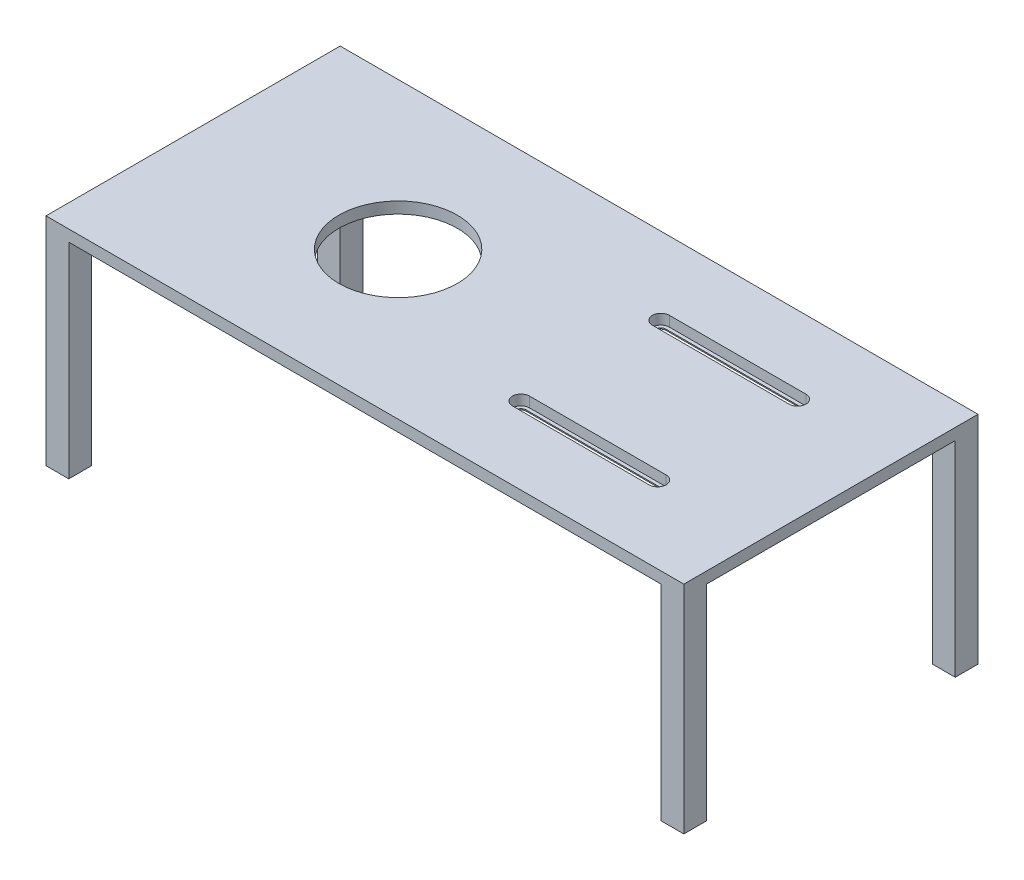
ISO-10303-21;
HEADER;
FILE_DESCRIPTION(('STEP AP214'),'2;1');
FILE_NAME('part.step','',(''),(''),'','','');
FILE_SCHEMA(('AUTOMOTIVE_DESIGN { 1 0 10303 214 1 1 1 1 }'));
ENDSEC;
DATA;
#1=APPLICATION_CONTEXT('core data for automotive mechanical design processes');
#2=APPLICATION_PROTOCOL_DEFINITION('international standard','automotive_design',2000,#1);
#3=PRODUCT_CONTEXT('',#1,'mechanical');
#4=PRODUCT('Part','Part','',(#3));
#5=PRODUCT_RELATED_PRODUCT_CATEGORY('part','',(#4));
#6=PRODUCT_DEFINITION_FORMATION('','',#4);
#7=PRODUCT_DEFINITION_CONTEXT('part definition',#1,'design');
#8=PRODUCT_DEFINITION('design','',#6,#7);
#9=PRODUCT_DEFINITION_SHAPE('','',#8);
#10=(LENGTH_UNIT() NAMED_UNIT(*) SI_UNIT(.MILLI.,.METRE.));
#11=(NAMED_UNIT(*) PLANE_ANGLE_UNIT() SI_UNIT($,.RADIAN.));
#12=(NAMED_UNIT(*) SI_UNIT($,.STERADIAN.) SOLID_ANGLE_UNIT());
#13=UNCERTAINTY_MEASURE_WITH_UNIT(LENGTH_MEASURE(1.E-05),#10,'distance_accuracy_value','');
#14=(GEOMETRIC_REPRESENTATION_CONTEXT(3) GLOBAL_UNCERTAINTY_ASSIGNED_CONTEXT((#13)) GLOBAL_UNIT_ASSIGNED_CONTEXT((#10,
#11,#12)) REPRESENTATION_CONTEXT('',''));
#15=CARTESIAN_POINT('',(0.,0.,0.));
#16=DIRECTION('',(0.,0.,1.));
#17=DIRECTION('',(1.,0.,0.));
#18=AXIS2_PLACEMENT_3D('',#15,#16,#17);
#19=CARTESIAN_POINT('',(0.,-90.,-93.01784780948));
#20=DIRECTION('',(0.,0.,1.));
#21=DIRECTION('',(1.,0.,0.));
#22=AXIS2_PLACEMENT_3D('',#19,#20,#21);
#23=PLANE('',#22);
#24=DIRECTION('',(1.,0.,0.));
#25=VECTOR('',#24,1.);
#26=CARTESIAN_POINT('',(174.634543984762,0.5,-93.01784780948));
#27=LINE('',#26,#25);
#28=CARTESIAN_POINT('',(174.634543984762,0.5,-93.01784780948));
#29=VERTEX_POINT('',#28);
#30=CARTESIAN_POINT('',(234.634543984762,0.5,-93.01784780948));
#31=VERTEX_POINT('',#30);
#32=EDGE_CURVE('E480',#29,#31,#27,.T.);
#33=ORIENTED_EDGE('',*,*,#32,.T.);
#34=DIRECTION('',(0.,1.,0.));
#35=VECTOR('',#34,1.);
#36=CARTESIAN_POINT('',(234.634543984762,-90.,-93.01784780948));
#37=LINE('',#36,#35);
#38=CARTESIAN_POINT('',(234.634543984762,0.,-93.01784780948));
#39=VERTEX_POINT('',#38);
#40=EDGE_CURVE('E264',#39,#31,#37,.T.);
#41=ORIENTED_EDGE('',*,*,#40,.F.);
#42=DIRECTION('',(1.,0.,0.));
#43=VECTOR('',#42,1.);
#44=CARTESIAN_POINT('',(0.,0.,-93.01784780948));
#45=LINE('',#44,#43);
#46=CARTESIAN_POINT('',(174.634543984762,0.,-93.01784780948));
#47=VERTEX_POINT('',#46);
#48=EDGE_CURVE('E428',#47,#39,#45,.T.);
#49=ORIENTED_EDGE('',*,*,#48,.F.);
#50=DIRECTION('',(0.,1.,0.));
#51=VECTOR('',#50,1.);
#52=CARTESIAN_POINT('',(174.634543984762,-90.,-93.01784780948));
#53=LINE('',#52,#51);
#54=EDGE_CURVE('E273',#47,#29,#53,.T.);
#55=ORIENTED_EDGE('',*,*,#54,.T.);
#56=EDGE_LOOP('',(#33,#41,#49,#55));
#57=FACE_BOUND('',#56,.T.);
#58=ADVANCED_FACE('F35',(#57),#23,.F.);
#59=CARTESIAN_POINT('',(174.634543984762,-90.,-95.26784780948));
#60=DIRECTION('',(0.,1.,0.));
#61=DIRECTION('',(0.,0.,1.));
#62=AXIS2_PLACEMENT_3D('',#59,#60,#61);
#63=CYLINDRICAL_SURFACE('',#62,2.24999999999998);
#64=CARTESIAN_POINT('',(174.634543984762,0.5,-95.26784780948));
#65=DIRECTION('',(0.,1.,0.));
#66=DIRECTION('',(0.,0.,1.));
#67=AXIS2_PLACEMENT_3D('',#64,#65,#66);
#68=CIRCLE('',#67,2.24999999999998);
#69=CARTESIAN_POINT('',(174.634543984762,0.5,-97.51784780948));
#70=VERTEX_POINT('',#69);
#71=EDGE_CURVE('E472',#70,#29,#68,.T.);
#72=ORIENTED_EDGE('',*,*,#71,.T.);
#73=ORIENTED_EDGE('',*,*,#54,.F.);
#74=CARTESIAN_POINT('',(174.634543984762,0.,-95.26784780948));
#75=DIRECTION('',(0.,1.,0.));
#76=DIRECTION('',(0.,0.,1.));
#77=AXIS2_PLACEMENT_3D('',#74,#75,#76);
#78=CIRCLE('',#77,2.24999999999998);
#79=CARTESIAN_POINT('',(174.634543984762,0.,-97.51784780948));
#80=VERTEX_POINT('',#79);
#81=EDGE_CURVE('E425',#80,#47,#78,.T.);
#82=ORIENTED_EDGE('',*,*,#81,.F.);
#83=DIRECTION('',(0.,1.,0.));
#84=VECTOR('',#83,1.);
#85=CARTESIAN_POINT('',(174.634543984762,-90.,-97.51784780948));
#86=LINE('',#85,#84);
#87=EDGE_CURVE('E277',#80,#70,#86,.T.);
#88=ORIENTED_EDGE('',*,*,#87,.T.);
#89=EDGE_LOOP('',(#72,#73,#82,#88));
#90=FACE_BOUND('',#89,.T.);
#91=ADVANCED_FACE('F549',(#90),#63,.F.);
#92=CARTESIAN_POINT('',(0.,-90.,-97.51784780948));
#93=DIRECTION('',(0.,0.,1.));
#94=DIRECTION('',(1.,0.,0.));
#95=AXIS2_PLACEMENT_3D('',#92,#93,#94);
#96=PLANE('',#95);
#97=DIRECTION('',(0.,1.,0.));
#98=VECTOR('',#97,1.);
#99=CARTESIAN_POINT('',(234.634543984762,-90.,-97.51784780948));
#100=LINE('',#99,#98);
#101=CARTESIAN_POINT('',(234.634543984762,0.,-97.51784780948));
#102=VERTEX_POINT('',#101);
#103=CARTESIAN_POINT('',(234.634543984762,0.5,-97.51784780948));
#104=VERTEX_POINT('',#103);
#105=EDGE_CURVE('E280',#102,#104,#100,.T.);
#106=ORIENTED_EDGE('',*,*,#105,.T.);
#107=DIRECTION('',(-1.,0.,0.));
#108=VECTOR('',#107,1.);
#109=CARTESIAN_POINT('',(174.634543984762,0.5,-97.51784780948));
#110=LINE('',#109,#108);
#111=EDGE_CURVE('E486',#104,#70,#110,.T.);
#112=ORIENTED_EDGE('',*,*,#111,.T.);
#113=ORIENTED_EDGE('',*,*,#87,.F.);
#114=DIRECTION('',(1.,0.,0.));
#115=VECTOR('',#114,1.);
#116=CARTESIAN_POINT('',(0.,0.,-97.51784780948));
#117=LINE('',#116,#115);
#118=EDGE_CURVE('E422',#80,#102,#117,.T.);
#119=ORIENTED_EDGE('',*,*,#118,.T.);
#120=EDGE_LOOP('',(#106,#112,#113,#119));
#121=FACE_BOUND('',#120,.T.);
#122=ADVANCED_FACE('F556',(#121),#96,.T.);
#123=CARTESIAN_POINT('',(234.634543984762,-90.,-95.26784780948));
#124=DIRECTION('',(0.,1.,0.));
#125=DIRECTION('',(0.,0.,1.));
#126=AXIS2_PLACEMENT_3D('',#123,#124,#125);
#127=CYLINDRICAL_SURFACE('',#126,2.24999999999998);
#128=CARTESIAN_POINT('',(234.634543984762,0.5,-95.26784780948));
#129=DIRECTION('',(0.,1.,0.));
#130=DIRECTION('',(0.,0.,1.));
#131=AXIS2_PLACEMENT_3D('',#128,#129,#130);
#132=CIRCLE('',#131,2.24999999999998);
#133=EDGE_CURVE('E483',#31,#104,#132,.T.);
#134=ORIENTED_EDGE('',*,*,#133,.T.);
#135=ORIENTED_EDGE('',*,*,#105,.F.);
#136=CARTESIAN_POINT('',(234.634543984762,0.,-95.26784780948));
#137=DIRECTION('',(0.,1.,0.));
#138=DIRECTION('',(0.,0.,1.));
#139=AXIS2_PLACEMENT_3D('',#136,#137,#138);
#140=CIRCLE('',#139,2.24999999999998);
#141=EDGE_CURVE('E383',#39,#102,#140,.T.);
#142=ORIENTED_EDGE('',*,*,#141,.F.);
#143=ORIENTED_EDGE('',*,*,#40,.T.);
#144=EDGE_LOOP('',(#134,#135,#142,#143));
#145=FACE_BOUND('',#144,.T.);
#146=ADVANCED_FACE('F561',(#145),#127,.F.);
#147=CARTESIAN_POINT('',(0.,5.,0.));
#148=DIRECTION('',(0.,1.,0.));
#149=DIRECTION('',(0.,0.,1.));
#150=AXIS2_PLACEMENT_3D('',#147,#148,#149);
#151=PLANE('',#150);
#152=CARTESIAN_POINT('',(174.634543984762,5.,-33.86784780948));
#153=DIRECTION('',(0.,1.,0.));
#154=DIRECTION('',(0.,0.,-1.));
#155=AXIS2_PLACEMENT_3D('',#152,#153,#154);
#156=CIRCLE('',#155,3.75);
#157=CARTESIAN_POINT('',(174.634543984762,5.,-37.61784780948));
#158=VERTEX_POINT('',#157);
#159=CARTESIAN_POINT('',(174.634543984762,5.,-30.11784780948));
#160=VERTEX_POINT('',#159);
#161=EDGE_CURVE('E50',#158,#160,#156,.T.);
#162=ORIENTED_EDGE('',*,*,#161,.F.);
#163=DIRECTION('',(-1.,0.,0.));
#164=VECTOR('',#163,1.);
#165=CARTESIAN_POINT('',(174.634543984762,5.,-37.61784780948));
#166=LINE('',#165,#164);
#167=CARTESIAN_POINT('',(234.634543984762,5.,-37.61784780948));
#168=VERTEX_POINT('',#167);
#169=EDGE_CURVE('E451',#168,#158,#166,.T.);
#170=ORIENTED_EDGE('',*,*,#169,.F.);
#171=CARTESIAN_POINT('',(234.634543984762,5.,-33.86784780948));
#172=DIRECTION('',(0.,1.,0.));
#173=DIRECTION('',(0.,0.,-1.));
#174=AXIS2_PLACEMENT_3D('',#171,#172,#173);
#175=CIRCLE('',#174,3.75);
#176=CARTESIAN_POINT('',(234.634543984762,5.,-30.11784780948));
#177=VERTEX_POINT('',#176);
#178=EDGE_CURVE('E465',#177,#168,#175,.T.);
#179=ORIENTED_EDGE('',*,*,#178,.F.);
#180=DIRECTION('',(1.,0.,0.));
#181=VECTOR('',#180,1.);
#182=CARTESIAN_POINT('',(174.634543984762,5.,-30.11784780948));
#183=LINE('',#182,#181);
#184=EDGE_CURVE('E462',#160,#177,#183,.T.);
#185=ORIENTED_EDGE('',*,*,#184,.F.);
#186=EDGE_LOOP('',(#162,#170,#179,#185));
#187=FACE_BOUND('',#186,.T.);
#188=CARTESIAN_POINT('',(174.634543984762,5.,-95.26784780948));
#189=DIRECTION('',(0.,1.,0.));
#190=DIRECTION('',(0.,0.,1.));
#191=AXIS2_PLACEMENT_3D('',#188,#189,#190);
#192=CIRCLE('',#191,3.75);
#193=CARTESIAN_POINT('',(174.634543984762,5.,-99.01784780948));
#194=VERTEX_POINT('',#193);
#195=CARTESIAN_POINT('',(174.634543984762,5.,-91.51784780948));
#196=VERTEX_POINT('',#195);
#197=EDGE_CURVE('E489',#194,#196,#192,.T.);
#198=ORIENTED_EDGE('',*,*,#197,.F.);
#199=DIRECTION('',(-1.,0.,0.));
#200=VECTOR('',#199,1.);
#201=CARTESIAN_POINT('',(174.634543984762,5.,-99.01784780948));
#202=LINE('',#201,#200);
#203=CARTESIAN_POINT('',(234.634543984762,5.,-99.01784780948));
#204=VERTEX_POINT('',#203);
#205=EDGE_CURVE('E494',#204,#194,#202,.T.);
#206=ORIENTED_EDGE('',*,*,#205,.F.);
#207=CARTESIAN_POINT('',(234.634543984762,5.,-95.26784780948));
#208=DIRECTION('',(0.,1.,0.));
#209=DIRECTION('',(0.,0.,1.));
#210=AXIS2_PLACEMENT_3D('',#207,#208,#209);
#211=CIRCLE('',#210,3.75);
#212=CARTESIAN_POINT('',(234.634543984762,5.,-91.51784780948));
#213=VERTEX_POINT('',#212);
#214=EDGE_CURVE('E508',#213,#204,#211,.T.);
#215=ORIENTED_EDGE('',*,*,#214,.F.);
#216=DIRECTION('',(1.,0.,0.));
#217=VECTOR('',#216,1.);
#218=CARTESIAN_POINT('',(174.634543984762,5.,-91.51784780948));
#219=LINE('',#218,#217);
#220=EDGE_CURVE('E505',#196,#213,#219,.T.);
#221=ORIENTED_EDGE('',*,*,#220,.F.);
#222=EDGE_LOOP('',(#198,#206,#215,#221));
#223=FACE_BOUND('',#222,.T.);
#224=DIRECTION('',(1.,0.,0.));
#225=VECTOR('',#224,1.);
#226=CARTESIAN_POINT('',(0.,5.,-129.13569561896));
#227=LINE('',#226,#225);
#228=CARTESIAN_POINT('',(0.,5.,-129.13569561896));
#229=VERTEX_POINT('',#228);
#230=CARTESIAN_POINT('',(280.,5.,-129.13569561896));
#231=VERTEX_POINT('',#230);
#232=EDGE_CURVE('E380',#229,#231,#227,.T.);
#233=ORIENTED_EDGE('',*,*,#232,.F.);
#234=DIRECTION('',(0.,0.,-1.));
#235=VECTOR('',#234,1.);
#236=CARTESIAN_POINT('',(0.,5.,0.));
#237=LINE('',#236,#235);
#238=CARTESIAN_POINT('',(0.,5.,0.));
#239=VERTEX_POINT('',#238);
#240=EDGE_CURVE('E372',#239,#229,#237,.T.);
#241=ORIENTED_EDGE('',*,*,#240,.F.);
#242=DIRECTION('',(1.,0.,0.));
#243=VECTOR('',#242,1.);
#244=CARTESIAN_POINT('',(0.,5.,0.));
#245=LINE('',#244,#243);
#246=CARTESIAN_POINT('',(280.,5.,0.));
#247=VERTEX_POINT('',#246);
#248=EDGE_CURVE('E375',#239,#247,#245,.T.);
#249=ORIENTED_EDGE('',*,*,#248,.T.);
#250=DIRECTION('',(0.,0.,-1.));
#251=VECTOR('',#250,1.);
#252=CARTESIAN_POINT('',(280.,5.,0.));
#253=LINE('',#252,#251);
#254=EDGE_CURVE('E378',#247,#231,#253,.T.);
#255=ORIENTED_EDGE('',*,*,#254,.T.);
#256=EDGE_LOOP('',(#233,#241,#249,#255));
#257=FACE_BOUND('',#256,.T.);
#258=CARTESIAN_POINT('',(90.,5.,-64.56784780948));
#259=DIRECTION('',(0.,1.,0.));
#260=DIRECTION('',(0.,0.,1.));
#261=AXIS2_PLACEMENT_3D('',#258,#259,#260);
#262=CIRCLE('',#261,26.);
#263=CARTESIAN_POINT('',(90.,5.,-38.56784780948));
#264=VERTEX_POINT('',#263);
#265=EDGE_CURVE('E369',#264,#264,#262,.T.);
#266=ORIENTED_EDGE('',*,*,#265,.F.);
#267=EDGE_LOOP('',(#266));
#268=FACE_BOUND('',#267,.T.);
#269=ADVANCED_FACE('F527',(#187,#223,#257,#268),#151,.T.);
#270=CARTESIAN_POINT('',(0.,0.,0.));
#271=DIRECTION('',(0.,1.,0.));
#272=DIRECTION('',(0.,0.,1.));
#273=AXIS2_PLACEMENT_3D('',#270,#271,#272);
#274=PLANE('',#273);
#275=DIRECTION('',(1.,0.,0.));
#276=VECTOR('',#275,1.);
#277=CARTESIAN_POINT('',(0.,0.,-119.13569561896));
#278=LINE('',#277,#276);
#279=CARTESIAN_POINT('',(0.,0.,-119.13569561896));
#280=VERTEX_POINT('',#279);
#281=CARTESIAN_POINT('',(10.,0.,-119.13569561896));
#282=VERTEX_POINT('',#281);
#283=EDGE_CURVE('E386',#280,#282,#278,.T.);
#284=ORIENTED_EDGE('',*,*,#283,.T.);
#285=DIRECTION('',(0.,0.,-1.));
#286=VECTOR('',#285,1.);
#287=CARTESIAN_POINT('',(10.,0.,0.));
#288=LINE('',#287,#286);
#289=CARTESIAN_POINT('',(10.,0.,-129.13569561896));
#290=VERTEX_POINT('',#289);
#291=EDGE_CURVE('E373',#282,#290,#288,.T.);
#292=ORIENTED_EDGE('',*,*,#291,.T.);
#293=DIRECTION('',(1.,0.,0.));
#294=VECTOR('',#293,1.);
#295=CARTESIAN_POINT('',(0.,0.,-129.13569561896));
#296=LINE('',#295,#294);
#297=CARTESIAN_POINT('',(270.,0.,-129.13569561896));
#298=VERTEX_POINT('',#297);
#299=EDGE_CURVE('E416',#290,#298,#296,.T.);
#300=ORIENTED_EDGE('',*,*,#299,.T.);
#301=DIRECTION('',(0.,0.,-1.));
#302=VECTOR('',#301,1.);
#303=CARTESIAN_POINT('',(270.,0.,0.));
#304=LINE('',#303,#302);
#305=CARTESIAN_POINT('',(270.,0.,-119.13569561896));
#306=VERTEX_POINT('',#305);
#307=EDGE_CURVE('E413',#306,#298,#304,.T.);
#308=ORIENTED_EDGE('',*,*,#307,.F.);
#309=DIRECTION('',(-1.,0.,0.));
#310=VECTOR('',#309,1.);
#311=CARTESIAN_POINT('',(0.,0.,-119.13569561896));
#312=LINE('',#311,#310);
#313=CARTESIAN_POINT('',(280.,0.,-119.13569561896));
#314=VERTEX_POINT('',#313);
#315=EDGE_CURVE('E410',#314,#306,#312,.T.);
#316=ORIENTED_EDGE('',*,*,#315,.F.);
#317=DIRECTION('',(0.,0.,-1.));
#318=VECTOR('',#317,1.);
#319=CARTESIAN_POINT('',(280.,0.,0.));
#320=LINE('',#319,#318);
#321=CARTESIAN_POINT('',(280.,0.,-9.99999999999997));
#322=VERTEX_POINT('',#321);
#323=EDGE_CURVE('E407',#322,#314,#320,.T.);
#324=ORIENTED_EDGE('',*,*,#323,.F.);
#325=DIRECTION('',(-1.,0.,0.));
#326=VECTOR('',#325,1.);
#327=CARTESIAN_POINT('',(0.,0.,-9.99999999999997));
#328=LINE('',#327,#326);
#329=CARTESIAN_POINT('',(270.,0.,-9.99999999999997));
#330=VERTEX_POINT('',#329);
#331=EDGE_CURVE('E404',#322,#330,#328,.T.);
#332=ORIENTED_EDGE('',*,*,#331,.T.);
#333=DIRECTION('',(0.,0.,1.));
#334=VECTOR('',#333,1.);
#335=CARTESIAN_POINT('',(270.,0.,0.));
#336=LINE('',#335,#334);
#337=CARTESIAN_POINT('',(270.,0.,0.));
#338=VERTEX_POINT('',#337);
#339=EDGE_CURVE('E401',#330,#338,#336,.T.);
#340=ORIENTED_EDGE('',*,*,#339,.T.);
#341=DIRECTION('',(1.,0.,0.));
#342=VECTOR('',#341,1.);
#343=CARTESIAN_POINT('',(0.,0.,0.));
#344=LINE('',#343,#342);
#345=CARTESIAN_POINT('',(10.,0.,0.));
#346=VERTEX_POINT('',#345);
#347=EDGE_CURVE('E398',#346,#338,#344,.T.);
#348=ORIENTED_EDGE('',*,*,#347,.F.);
#349=DIRECTION('',(0.,0.,1.));
#350=VECTOR('',#349,1.);
#351=CARTESIAN_POINT('',(10.,0.,0.));
#352=LINE('',#351,#350);
#353=CARTESIAN_POINT('',(10.,0.,-9.99999999999997));
#354=VERTEX_POINT('',#353);
#355=EDGE_CURVE('E395',#354,#346,#352,.T.);
#356=ORIENTED_EDGE('',*,*,#355,.F.);
#357=DIRECTION('',(1.,0.,0.));
#358=VECTOR('',#357,1.);
#359=CARTESIAN_POINT('',(0.,0.,-9.99999999999997));
#360=LINE('',#359,#358);
#361=CARTESIAN_POINT('',(0.,0.,-9.99999999999997));
#362=VERTEX_POINT('',#361);
#363=EDGE_CURVE('E392',#362,#354,#360,.T.);
#364=ORIENTED_EDGE('',*,*,#363,.F.);
#365=DIRECTION('',(0.,0.,-1.));
#366=VECTOR('',#365,1.);
#367=CARTESIAN_POINT('',(0.,0.,0.));
#368=LINE('',#367,#366);
#369=EDGE_CURVE('E389',#362,#280,#368,.T.);
#370=ORIENTED_EDGE('',*,*,#369,.T.);
#371=EDGE_LOOP('',(#284,#292,#300,#308,#316,#324,#332,#340,#348,#356,#364,#370));
#372=FACE_BOUND('',#371,.T.);
#373=CARTESIAN_POINT('',(90.,0.,-64.56784780948));
#374=DIRECTION('',(0.,1.,0.));
#375=DIRECTION('',(0.,0.,1.));
#376=AXIS2_PLACEMENT_3D('',#373,#374,#375);
#377=CIRCLE('',#376,26.);
#378=CARTESIAN_POINT('',(90.,0.,-38.56784780948));
#379=VERTEX_POINT('',#378);
#380=EDGE_CURVE('E360',#379,#379,#377,.T.);
#381=ORIENTED_EDGE('',*,*,#380,.T.);
#382=EDGE_LOOP('',(#381));
#383=FACE_BOUND('',#382,.T.);
#384=ORIENTED_EDGE('',*,*,#81,.T.);
#385=ORIENTED_EDGE('',*,*,#48,.T.);
#386=ORIENTED_EDGE('',*,*,#141,.T.);
#387=ORIENTED_EDGE('',*,*,#118,.F.);
#388=EDGE_LOOP('',(#384,#385,#386,#387));
#389=FACE_BOUND('',#388,.T.);
#390=CARTESIAN_POINT('',(234.634543984762,0.,-33.86784780948));
#391=DIRECTION('',(0.,1.,0.));
#392=DIRECTION('',(0.,0.,1.));
#393=AXIS2_PLACEMENT_3D('',#390,#391,#392);
#394=CIRCLE('',#393,2.24999999999998);
#395=CARTESIAN_POINT('',(234.634543984762,0.,-36.11784780948));
#396=VERTEX_POINT('',#395);
#397=CARTESIAN_POINT('',(234.634543984762,0.,-31.61784780948));
#398=VERTEX_POINT('',#397);
#399=EDGE_CURVE('E11',#396,#398,#394,.F.);
#400=ORIENTED_EDGE('',*,*,#399,.F.);
#401=DIRECTION('',(1.,0.,0.));
#402=VECTOR('',#401,1.);
#403=CARTESIAN_POINT('',(0.,0.,-36.11784780948));
#404=LINE('',#403,#402);
#405=CARTESIAN_POINT('',(174.634543984762,0.,-36.11784780948));
#406=VERTEX_POINT('',#405);
#407=EDGE_CURVE('E431',#406,#396,#404,.T.);
#408=ORIENTED_EDGE('',*,*,#407,.F.);
#409=CARTESIAN_POINT('',(174.634543984762,0.,-33.86784780948));
#410=DIRECTION('',(0.,1.,0.));
#411=DIRECTION('',(0.,0.,1.));
#412=AXIS2_PLACEMENT_3D('',#409,#410,#411);
#413=CIRCLE('',#412,2.24999999999998);
#414=CARTESIAN_POINT('',(174.634543984762,0.,-31.61784780948));
#415=VERTEX_POINT('',#414);
#416=EDGE_CURVE('E433',#415,#406,#413,.F.);
#417=ORIENTED_EDGE('',*,*,#416,.F.);
#418=DIRECTION('',(1.,0.,0.));
#419=VECTOR('',#418,1.);
#420=CARTESIAN_POINT('',(0.,0.,-31.61784780948));
#421=LINE('',#420,#419);
#422=EDGE_CURVE('E43',#415,#398,#421,.T.);
#423=ORIENTED_EDGE('',*,*,#422,.T.);
#424=EDGE_LOOP('',(#400,#408,#417,#423));
#425=FACE_BOUND('',#424,.T.);
#426=ADVANCED_FACE('F436',(#372,#383,#389,#425),#274,.F.);
#427=CARTESIAN_POINT('',(0.,5.,0.));
#428=DIRECTION('',(-1.,0.,0.));
#429=DIRECTION('',(0.,0.,1.));
#430=AXIS2_PLACEMENT_3D('',#427,#428,#429);
#431=PLANE('',#430);
#432=ORIENTED_EDGE('',*,*,#369,.F.);
#433=DIRECTION('',(0.,1.,0.));
#434=VECTOR('',#433,1.);
#435=CARTESIAN_POINT('',(0.,-90.,-9.99999999999997));
#436=LINE('',#435,#434);
#437=CARTESIAN_POINT('',(0.,-90.,-9.99999999999997));
#438=VERTEX_POINT('',#437);
#439=EDGE_CURVE('E356',#438,#362,#436,.T.);
#440=ORIENTED_EDGE('',*,*,#439,.F.);
#441=DIRECTION('',(0.,0.,-1.));
#442=VECTOR('',#441,1.);
#443=CARTESIAN_POINT('',(0.,-90.,0.));
#444=LINE('',#443,#442);
#445=CARTESIAN_POINT('',(0.,-90.,0.));
#446=VERTEX_POINT('',#445);
#447=EDGE_CURVE('E349',#446,#438,#444,.T.);
#448=ORIENTED_EDGE('',*,*,#447,.F.);
#449=DIRECTION('',(0.,1.,0.));
#450=VECTOR('',#449,1.);
#451=CARTESIAN_POINT('',(0.,-90.,0.));
#452=LINE('',#451,#450);
#453=EDGE_CURVE('E364',#446,#239,#452,.T.);
#454=ORIENTED_EDGE('',*,*,#453,.T.);
#455=ORIENTED_EDGE('',*,*,#240,.T.);
#456=DIRECTION('',(0.,-1.,0.));
#457=VECTOR('',#456,1.);
#458=CARTESIAN_POINT('',(0.,5.,-129.13569561896));
#459=LINE('',#458,#457);
#460=CARTESIAN_POINT('',(0.,-90.,-129.13569561896));
#461=VERTEX_POINT('',#460);
#462=EDGE_CURVE('E320',#229,#461,#459,.T.);
#463=ORIENTED_EDGE('',*,*,#462,.T.);
#464=DIRECTION('',(0.,0.,-1.));
#465=VECTOR('',#464,1.);
#466=CARTESIAN_POINT('',(0.,-90.,0.));
#467=LINE('',#466,#465);
#468=CARTESIAN_POINT('',(0.,-90.,-119.13569561896));
#469=VERTEX_POINT('',#468);
#470=EDGE_CURVE('E315',#469,#461,#467,.T.);
#471=ORIENTED_EDGE('',*,*,#470,.F.);
#472=DIRECTION('',(0.,-1.,0.));
#473=VECTOR('',#472,1.);
#474=CARTESIAN_POINT('',(0.,5.,-119.13569561896));
#475=LINE('',#474,#473);
#476=EDGE_CURVE('E318',#280,#469,#475,.T.);
#477=ORIENTED_EDGE('',*,*,#476,.F.);
#478=EDGE_LOOP('',(#432,#440,#448,#454,#455,#463,#471,#477));
#479=FACE_BOUND('',#478,.T.);
#480=ADVANCED_FACE('F616',(#479),#431,.T.);
#481=CARTESIAN_POINT('',(0.,5.,0.));
#482=DIRECTION('',(0.,0.,-1.));
#483=DIRECTION('',(-1.,0.,0.));
#484=AXIS2_PLACEMENT_3D('',#481,#482,#483);
#485=PLANE('',#484);
#486=ORIENTED_EDGE('',*,*,#347,.T.);
#487=DIRECTION('',(0.,-1.,0.));
#488=VECTOR('',#487,1.);
#489=CARTESIAN_POINT('',(270.,5.,0.));
#490=LINE('',#489,#488);
#491=CARTESIAN_POINT('',(270.,-90.,0.));
#492=VERTEX_POINT('',#491);
#493=EDGE_CURVE('E342',#338,#492,#490,.T.);
#494=ORIENTED_EDGE('',*,*,#493,.T.);
#495=DIRECTION('',(1.,0.,0.));
#496=VECTOR('',#495,1.);
#497=CARTESIAN_POINT('',(0.,-90.,0.));
#498=LINE('',#497,#496);
#499=CARTESIAN_POINT('',(280.,-90.,0.));
#500=VERTEX_POINT('',#499);
#501=EDGE_CURVE('E332',#492,#500,#498,.T.);
#502=ORIENTED_EDGE('',*,*,#501,.T.);
#503=DIRECTION('',(0.,-1.,0.));
#504=VECTOR('',#503,1.);
#505=CARTESIAN_POINT('',(280.,5.,0.));
#506=LINE('',#505,#504);
#507=EDGE_CURVE('E340',#247,#500,#506,.T.);
#508=ORIENTED_EDGE('',*,*,#507,.F.);
#509=ORIENTED_EDGE('',*,*,#248,.F.);
#510=ORIENTED_EDGE('',*,*,#453,.F.);
#511=DIRECTION('',(1.,0.,0.));
#512=VECTOR('',#511,1.);
#513=CARTESIAN_POINT('',(0.,-90.,0.));
#514=LINE('',#513,#512);
#515=CARTESIAN_POINT('',(10.,-90.,0.));
#516=VERTEX_POINT('',#515);
#517=EDGE_CURVE('E351',#446,#516,#514,.T.);
#518=ORIENTED_EDGE('',*,*,#517,.T.);
#519=DIRECTION('',(0.,1.,0.));
#520=VECTOR('',#519,1.);
#521=CARTESIAN_POINT('',(10.,-90.,0.));
#522=LINE('',#521,#520);
#523=EDGE_CURVE('E361',#516,#346,#522,.T.);
#524=ORIENTED_EDGE('',*,*,#523,.T.);
#525=EDGE_LOOP('',(#486,#494,#502,#508,#509,#510,#518,#524));
#526=FACE_BOUND('',#525,.T.);
#527=ADVANCED_FACE('F625',(#526),#485,.F.);
#528=CARTESIAN_POINT('',(280.,5.,0.));
#529=DIRECTION('',(-1.,0.,0.));
#530=DIRECTION('',(0.,0.,1.));
#531=AXIS2_PLACEMENT_3D('',#528,#529,#530);
#532=PLANE('',#531);
#533=ORIENTED_EDGE('',*,*,#323,.T.);
#534=DIRECTION('',(0.,1.,0.));
#535=VECTOR('',#534,1.);
#536=CARTESIAN_POINT('',(280.,-90.,-119.13569561896));
#537=LINE('',#536,#535);
#538=CARTESIAN_POINT('',(280.,-90.,-119.13569561896));
#539=VERTEX_POINT('',#538);
#540=EDGE_CURVE('E294',#539,#314,#537,.T.);
#541=ORIENTED_EDGE('',*,*,#540,.F.);
#542=DIRECTION('',(0.,0.,-1.));
#543=VECTOR('',#542,1.);
#544=CARTESIAN_POINT('',(280.,-90.,0.));
#545=LINE('',#544,#543);
#546=CARTESIAN_POINT('',(280.,-90.,-129.13569561896));
#547=VERTEX_POINT('',#546);
#548=EDGE_CURVE('E287',#539,#547,#545,.T.);
#549=ORIENTED_EDGE('',*,*,#548,.T.);
#550=DIRECTION('',(0.,1.,0.));
#551=VECTOR('',#550,1.);
#552=CARTESIAN_POINT('',(280.,-90.,-129.13569561896));
#553=LINE('',#552,#551);
#554=EDGE_CURVE('E302',#547,#231,#553,.T.);
#555=ORIENTED_EDGE('',*,*,#554,.T.);
#556=ORIENTED_EDGE('',*,*,#254,.F.);
#557=ORIENTED_EDGE('',*,*,#507,.T.);
#558=DIRECTION('',(0.,0.,-1.));
#559=VECTOR('',#558,1.);
#560=CARTESIAN_POINT('',(280.,-90.,0.));
#561=LINE('',#560,#559);
#562=CARTESIAN_POINT('',(280.,-90.,-9.99999999999997));
#563=VERTEX_POINT('',#562);
#564=EDGE_CURVE('E335',#500,#563,#561,.T.);
#565=ORIENTED_EDGE('',*,*,#564,.T.);
#566=DIRECTION('',(0.,-1.,0.));
#567=VECTOR('',#566,1.);
#568=CARTESIAN_POINT('',(280.,5.,-9.99999999999997));
#569=LINE('',#568,#567);
#570=EDGE_CURVE('E338',#322,#563,#569,.T.);
#571=ORIENTED_EDGE('',*,*,#570,.F.);
#572=EDGE_LOOP('',(#533,#541,#549,#555,#556,#557,#565,#571));
#573=FACE_BOUND('',#572,.T.);
#574=ADVANCED_FACE('F621',(#573),#532,.F.);
#575=CARTESIAN_POINT('',(0.,5.,-129.13569561896));
#576=DIRECTION('',(0.,0.,-1.));
#577=DIRECTION('',(-1.,0.,0.));
#578=AXIS2_PLACEMENT_3D('',#575,#576,#577);
#579=PLANE('',#578);
#580=ORIENTED_EDGE('',*,*,#299,.F.);
#581=DIRECTION('',(0.,-1.,0.));
#582=VECTOR('',#581,1.);
#583=CARTESIAN_POINT('',(10.,5.,-129.13569561896));
#584=LINE('',#583,#582);
#585=CARTESIAN_POINT('',(10.,-90.,-129.13569561896));
#586=VERTEX_POINT('',#585);
#587=EDGE_CURVE('E322',#290,#586,#584,.T.);
#588=ORIENTED_EDGE('',*,*,#587,.T.);
#589=DIRECTION('',(1.,0.,0.));
#590=VECTOR('',#589,1.);
#591=CARTESIAN_POINT('',(0.,-90.,-129.13569561896));
#592=LINE('',#591,#590);
#593=EDGE_CURVE('E312',#461,#586,#592,.T.);
#594=ORIENTED_EDGE('',*,*,#593,.F.);
#595=ORIENTED_EDGE('',*,*,#462,.F.);
#596=ORIENTED_EDGE('',*,*,#232,.T.);
#597=ORIENTED_EDGE('',*,*,#554,.F.);
#598=DIRECTION('',(1.,0.,0.));
#599=VECTOR('',#598,1.);
#600=CARTESIAN_POINT('',(0.,-90.,-129.13569561896));
#601=LINE('',#600,#599);
#602=CARTESIAN_POINT('',(270.,-90.,-129.13569561896));
#603=VERTEX_POINT('',#602);
#604=EDGE_CURVE('E290',#603,#547,#601,.T.);
#605=ORIENTED_EDGE('',*,*,#604,.F.);
#606=DIRECTION('',(0.,1.,0.));
#607=VECTOR('',#606,1.);
#608=CARTESIAN_POINT('',(270.,-90.,-129.13569561896));
#609=LINE('',#608,#607);
#610=EDGE_CURVE('E299',#603,#298,#609,.T.);
#611=ORIENTED_EDGE('',*,*,#610,.T.);
#612=EDGE_LOOP('',(#580,#588,#594,#595,#596,#597,#605,#611));
#613=FACE_BOUND('',#612,.T.);
#614=ADVANCED_FACE('F618',(#613),#579,.T.);
#615=CARTESIAN_POINT('',(90.,5.,-64.56784780948));
#616=DIRECTION('',(0.,-1.,0.));
#617=DIRECTION('',(0.,0.,-1.));
#618=AXIS2_PLACEMENT_3D('',#615,#616,#617);
#619=CYLINDRICAL_SURFACE('',#618,26.);
#620=ORIENTED_EDGE('',*,*,#265,.T.);
#621=EDGE_LOOP('',(#620));
#622=FACE_BOUND('',#621,.T.);
#623=ORIENTED_EDGE('',*,*,#380,.F.);
#624=EDGE_LOOP('',(#623));
#625=FACE_BOUND('',#624,.T.);
#626=ADVANCED_FACE('F37',(#622,#625),#619,.F.);
#627=CARTESIAN_POINT('',(0.,-90.,-9.99999999999997));
#628=DIRECTION('',(0.,0.,1.));
#629=DIRECTION('',(1.,0.,0.));
#630=AXIS2_PLACEMENT_3D('',#627,#628,#629);
#631=PLANE('',#630);
#632=ORIENTED_EDGE('',*,*,#439,.T.);
#633=ORIENTED_EDGE('',*,*,#363,.T.);
#634=DIRECTION('',(0.,1.,0.));
#635=VECTOR('',#634,1.);
#636=CARTESIAN_POINT('',(10.,-90.,-9.99999999999997));
#637=LINE('',#636,#635);
#638=CARTESIAN_POINT('',(10.,-90.,-9.99999999999997));
#639=VERTEX_POINT('',#638);
#640=EDGE_CURVE('E357',#639,#354,#637,.T.);
#641=ORIENTED_EDGE('',*,*,#640,.F.);
#642=DIRECTION('',(1.,0.,0.));
#643=VECTOR('',#642,1.);
#644=CARTESIAN_POINT('',(0.,-90.,-9.99999999999997));
#645=LINE('',#644,#643);
#646=EDGE_CURVE('E346',#438,#639,#645,.T.);
#647=ORIENTED_EDGE('',*,*,#646,.F.);
#648=EDGE_LOOP('',(#632,#633,#641,#647));
#649=FACE_BOUND('',#648,.T.);
#650=ADVANCED_FACE('F606',(#649),#631,.F.);
#651=CARTESIAN_POINT('',(10.,-90.,0.));
#652=DIRECTION('',(-1.,0.,0.));
#653=DIRECTION('',(0.,0.,1.));
#654=AXIS2_PLACEMENT_3D('',#651,#652,#653);
#655=PLANE('',#654);
#656=ORIENTED_EDGE('',*,*,#640,.T.);
#657=ORIENTED_EDGE('',*,*,#355,.T.);
#658=ORIENTED_EDGE('',*,*,#523,.F.);
#659=DIRECTION('',(0.,0.,1.));
#660=VECTOR('',#659,1.);
#661=CARTESIAN_POINT('',(10.,-90.,0.));
#662=LINE('',#661,#660);
#663=EDGE_CURVE('E354',#639,#516,#662,.T.);
#664=ORIENTED_EDGE('',*,*,#663,.F.);
#665=EDGE_LOOP('',(#656,#657,#658,#664));
#666=FACE_BOUND('',#665,.T.);
#667=ADVANCED_FACE('F602',(#666),#655,.F.);
#668=CARTESIAN_POINT('',(0.,-90.,0.));
#669=DIRECTION('',(0.,1.,0.));
#670=DIRECTION('',(0.,0.,1.));
#671=AXIS2_PLACEMENT_3D('',#668,#669,#670);
#672=PLANE('',#671);
#673=ORIENTED_EDGE('',*,*,#646,.T.);
#674=ORIENTED_EDGE('',*,*,#663,.T.);
#675=ORIENTED_EDGE('',*,*,#517,.F.);
#676=ORIENTED_EDGE('',*,*,#447,.T.);
#677=EDGE_LOOP('',(#673,#674,#675,#676));
#678=FACE_BOUND('',#677,.T.);
#679=ADVANCED_FACE('F598',(#678),#672,.F.);
#680=CARTESIAN_POINT('',(0.,5.,-9.99999999999997));
#681=DIRECTION('',(0.,0.,1.));
#682=DIRECTION('',(1.,0.,0.));
#683=AXIS2_PLACEMENT_3D('',#680,#681,#682);
#684=PLANE('',#683);
#685=DIRECTION('',(0.,-1.,0.));
#686=VECTOR('',#685,1.);
#687=CARTESIAN_POINT('',(270.,5.,-9.99999999999997));
#688=LINE('',#687,#686);
#689=CARTESIAN_POINT('',(270.,-90.,-9.99999999999997));
#690=VERTEX_POINT('',#689);
#691=EDGE_CURVE('E344',#330,#690,#688,.T.);
#692=ORIENTED_EDGE('',*,*,#691,.F.);
#693=ORIENTED_EDGE('',*,*,#331,.F.);
#694=ORIENTED_EDGE('',*,*,#570,.T.);
#695=DIRECTION('',(-1.,0.,0.));
#696=VECTOR('',#695,1.);
#697=CARTESIAN_POINT('',(0.,-90.,-9.99999999999997));
#698=LINE('',#697,#696);
#699=EDGE_CURVE('E326',#563,#690,#698,.T.);
#700=ORIENTED_EDGE('',*,*,#699,.T.);
#701=EDGE_LOOP('',(#692,#693,#694,#700));
#702=FACE_BOUND('',#701,.T.);
#703=ADVANCED_FACE('F594',(#702),#684,.F.);
#704=CARTESIAN_POINT('',(270.,5.,0.));
#705=DIRECTION('',(1.,0.,0.));
#706=DIRECTION('',(0.,0.,-1.));
#707=AXIS2_PLACEMENT_3D('',#704,#705,#706);
#708=PLANE('',#707);
#709=ORIENTED_EDGE('',*,*,#493,.F.);
#710=ORIENTED_EDGE('',*,*,#339,.F.);
#711=ORIENTED_EDGE('',*,*,#691,.T.);
#712=DIRECTION('',(0.,0.,1.));
#713=VECTOR('',#712,1.);
#714=CARTESIAN_POINT('',(270.,-90.,0.));
#715=LINE('',#714,#713);
#716=EDGE_CURVE('E329',#690,#492,#715,.T.);
#717=ORIENTED_EDGE('',*,*,#716,.T.);
#718=EDGE_LOOP('',(#709,#710,#711,#717));
#719=FACE_BOUND('',#718,.T.);
#720=ADVANCED_FACE('F590',(#719),#708,.F.);
#721=CARTESIAN_POINT('',(0.,-90.,0.));
#722=DIRECTION('',(0.,1.,0.));
#723=DIRECTION('',(0.,0.,1.));
#724=AXIS2_PLACEMENT_3D('',#721,#722,#723);
#725=PLANE('',#724);
#726=ORIENTED_EDGE('',*,*,#699,.F.);
#727=ORIENTED_EDGE('',*,*,#564,.F.);
#728=ORIENTED_EDGE('',*,*,#501,.F.);
#729=ORIENTED_EDGE('',*,*,#716,.F.);
#730=EDGE_LOOP('',(#726,#727,#728,#729));
#731=FACE_BOUND('',#730,.T.);
#732=ADVANCED_FACE('F586',(#731),#725,.F.);
#733=CARTESIAN_POINT('',(0.,5.,-119.13569561896));
#734=DIRECTION('',(0.,0.,-1.));
#735=DIRECTION('',(-1.,0.,0.));
#736=AXIS2_PLACEMENT_3D('',#733,#734,#735);
#737=PLANE('',#736);
#738=DIRECTION('',(0.,-1.,0.));
#739=VECTOR('',#738,1.);
#740=CARTESIAN_POINT('',(10.,5.,-119.13569561896));
#741=LINE('',#740,#739);
#742=CARTESIAN_POINT('',(10.,-90.,-119.13569561896));
#743=VERTEX_POINT('',#742);
#744=EDGE_CURVE('E324',#282,#743,#741,.T.);
#745=ORIENTED_EDGE('',*,*,#744,.F.);
#746=ORIENTED_EDGE('',*,*,#283,.F.);
#747=ORIENTED_EDGE('',*,*,#476,.T.);
#748=DIRECTION('',(1.,0.,0.));
#749=VECTOR('',#748,1.);
#750=CARTESIAN_POINT('',(0.,-90.,-119.13569561896));
#751=LINE('',#750,#749);
#752=EDGE_CURVE('E298',#469,#743,#751,.T.);
#753=ORIENTED_EDGE('',*,*,#752,.T.);
#754=EDGE_LOOP('',(#745,#746,#747,#753));
#755=FACE_BOUND('',#754,.T.);
#756=ADVANCED_FACE('F582',(#755),#737,.F.);
#757=CARTESIAN_POINT('',(10.,5.,0.));
#758=DIRECTION('',(-1.,0.,0.));
#759=DIRECTION('',(0.,0.,1.));
#760=AXIS2_PLACEMENT_3D('',#757,#758,#759);
#761=PLANE('',#760);
#762=ORIENTED_EDGE('',*,*,#587,.F.);
#763=ORIENTED_EDGE('',*,*,#291,.F.);
#764=ORIENTED_EDGE('',*,*,#744,.T.);
#765=DIRECTION('',(0.,0.,-1.));
#766=VECTOR('',#765,1.);
#767=CARTESIAN_POINT('',(10.,-90.,0.));
#768=LINE('',#767,#766);
#769=EDGE_CURVE('E309',#743,#586,#768,.T.);
#770=ORIENTED_EDGE('',*,*,#769,.T.);
#771=EDGE_LOOP('',(#762,#763,#764,#770));
#772=FACE_BOUND('',#771,.T.);
#773=ADVANCED_FACE('F578',(#772),#761,.F.);
#774=CARTESIAN_POINT('',(0.,-90.,0.));
#775=DIRECTION('',(0.,1.,0.));
#776=DIRECTION('',(0.,0.,1.));
#777=AXIS2_PLACEMENT_3D('',#774,#775,#776);
#778=PLANE('',#777);
#779=ORIENTED_EDGE('',*,*,#752,.F.);
#780=ORIENTED_EDGE('',*,*,#470,.T.);
#781=ORIENTED_EDGE('',*,*,#593,.T.);
#782=ORIENTED_EDGE('',*,*,#769,.F.);
#783=EDGE_LOOP('',(#779,#780,#781,#782));
#784=FACE_BOUND('',#783,.T.);
#785=ADVANCED_FACE('F574',(#784),#778,.F.);
#786=CARTESIAN_POINT('',(0.,-90.,-119.13569561896));
#787=DIRECTION('',(0.,0.,-1.));
#788=DIRECTION('',(-1.,0.,0.));
#789=AXIS2_PLACEMENT_3D('',#786,#787,#788);
#790=PLANE('',#789);
#791=ORIENTED_EDGE('',*,*,#540,.T.);
#792=ORIENTED_EDGE('',*,*,#315,.T.);
#793=DIRECTION('',(0.,1.,0.));
#794=VECTOR('',#793,1.);
#795=CARTESIAN_POINT('',(270.,-90.,-119.13569561896));
#796=LINE('',#795,#794);
#797=CARTESIAN_POINT('',(270.,-90.,-119.13569561896));
#798=VERTEX_POINT('',#797);
#799=EDGE_CURVE('E295',#798,#306,#796,.T.);
#800=ORIENTED_EDGE('',*,*,#799,.F.);
#801=DIRECTION('',(-1.,0.,0.));
#802=VECTOR('',#801,1.);
#803=CARTESIAN_POINT('',(0.,-90.,-119.13569561896));
#804=LINE('',#803,#802);
#805=EDGE_CURVE('E276',#539,#798,#804,.T.);
#806=ORIENTED_EDGE('',*,*,#805,.F.);
#807=EDGE_LOOP('',(#791,#792,#800,#806));
#808=FACE_BOUND('',#807,.T.);
#809=ADVANCED_FACE('F570',(#808),#790,.F.);
#810=CARTESIAN_POINT('',(270.,-90.,0.));
#811=DIRECTION('',(1.,0.,0.));
#812=DIRECTION('',(0.,0.,-1.));
#813=AXIS2_PLACEMENT_3D('',#810,#811,#812);
#814=PLANE('',#813);
#815=ORIENTED_EDGE('',*,*,#799,.T.);
#816=ORIENTED_EDGE('',*,*,#307,.T.);
#817=ORIENTED_EDGE('',*,*,#610,.F.);
#818=DIRECTION('',(0.,0.,-1.));
#819=VECTOR('',#818,1.);
#820=CARTESIAN_POINT('',(270.,-90.,0.));
#821=LINE('',#820,#819);
#822=EDGE_CURVE('E292',#798,#603,#821,.T.);
#823=ORIENTED_EDGE('',*,*,#822,.F.);
#824=EDGE_LOOP('',(#815,#816,#817,#823));
#825=FACE_BOUND('',#824,.T.);
#826=ADVANCED_FACE('F566',(#825),#814,.F.);
#827=CARTESIAN_POINT('',(0.,-90.,0.));
#828=DIRECTION('',(0.,1.,0.));
#829=DIRECTION('',(0.,0.,1.));
#830=AXIS2_PLACEMENT_3D('',#827,#828,#829);
#831=PLANE('',#830);
#832=ORIENTED_EDGE('',*,*,#805,.T.);
#833=ORIENTED_EDGE('',*,*,#822,.T.);
#834=ORIENTED_EDGE('',*,*,#604,.T.);
#835=ORIENTED_EDGE('',*,*,#548,.F.);
#836=EDGE_LOOP('',(#832,#833,#834,#835));
#837=FACE_BOUND('',#836,.T.);
#838=ADVANCED_FACE('F563',(#837),#831,.F.);
#839=CARTESIAN_POINT('',(234.634543984762,-90.,-33.86784780948));
#840=DIRECTION('',(0.,1.,0.));
#841=DIRECTION('',(0.,0.,1.));
#842=AXIS2_PLACEMENT_3D('',#839,#840,#841);
#843=CYLINDRICAL_SURFACE('',#842,2.24999999999998);
#844=CARTESIAN_POINT('',(234.634543984762,0.5,-33.86784780948));
#845=DIRECTION('',(0.,1.,0.));
#846=DIRECTION('',(0.,0.,-1.));
#847=AXIS2_PLACEMENT_3D('',#844,#845,#846);
#848=CIRCLE('',#847,2.24999999999998);
#849=CARTESIAN_POINT('',(234.634543984762,0.5,-31.61784780948));
#850=VERTEX_POINT('',#849);
#851=CARTESIAN_POINT('',(234.634543984762,0.5,-36.11784780948));
#852=VERTEX_POINT('',#851);
#853=EDGE_CURVE('E245',#850,#852,#848,.T.);
#854=ORIENTED_EDGE('',*,*,#853,.T.);
#855=DIRECTION('',(0.,1.,0.));
#856=VECTOR('',#855,1.);
#857=CARTESIAN_POINT('',(234.634543984762,-90.,-36.11784780948));
#858=LINE('',#857,#856);
#859=EDGE_CURVE('E266',#396,#852,#858,.T.);
#860=ORIENTED_EDGE('',*,*,#859,.F.);
#861=ORIENTED_EDGE('',*,*,#399,.T.);
#862=DIRECTION('',(0.,1.,0.));
#863=VECTOR('',#862,1.);
#864=CARTESIAN_POINT('',(234.634543984762,-90.,-31.61784780948));
#865=LINE('',#864,#863);
#866=EDGE_CURVE('E262',#398,#850,#865,.T.);
#867=ORIENTED_EDGE('',*,*,#866,.T.);
#868=EDGE_LOOP('',(#854,#860,#861,#867));
#869=FACE_BOUND('',#868,.T.);
#870=ADVANCED_FACE('F442',(#869),#843,.F.);
#871=CARTESIAN_POINT('',(0.,-90.,-31.61784780948));
#872=DIRECTION('',(0.,0.,1.));
#873=DIRECTION('',(1.,0.,0.));
#874=AXIS2_PLACEMENT_3D('',#871,#872,#873);
#875=PLANE('',#874);
#876=DIRECTION('',(0.,1.,0.));
#877=VECTOR('',#876,1.);
#878=CARTESIAN_POINT('',(174.634543984762,-90.,-31.61784780948));
#879=LINE('',#878,#877);
#880=CARTESIAN_POINT('',(174.634543984762,0.5,-31.61784780948));
#881=VERTEX_POINT('',#880);
#882=EDGE_CURVE('E256',#415,#881,#879,.T.);
#883=ORIENTED_EDGE('',*,*,#882,.T.);
#884=DIRECTION('',(1.,0.,0.));
#885=VECTOR('',#884,1.);
#886=CARTESIAN_POINT('',(174.634543984762,0.5,-31.61784780948));
#887=LINE('',#886,#885);
#888=EDGE_CURVE('E241',#881,#850,#887,.T.);
#889=ORIENTED_EDGE('',*,*,#888,.T.);
#890=ORIENTED_EDGE('',*,*,#866,.F.);
#891=ORIENTED_EDGE('',*,*,#422,.F.);
#892=EDGE_LOOP('',(#883,#889,#890,#891));
#893=FACE_BOUND('',#892,.T.);
#894=ADVANCED_FACE('F260',(#893),#875,.F.);
#895=CARTESIAN_POINT('',(174.634543984762,-90.,-33.86784780948));
#896=DIRECTION('',(0.,1.,0.));
#897=DIRECTION('',(0.,0.,1.));
#898=AXIS2_PLACEMENT_3D('',#895,#896,#897);
#899=CYLINDRICAL_SURFACE('',#898,2.24999999999998);
#900=CARTESIAN_POINT('',(174.634543984762,0.5,-33.86784780948));
#901=DIRECTION('',(0.,1.,0.));
#902=DIRECTION('',(0.,0.,-1.));
#903=AXIS2_PLACEMENT_3D('',#900,#901,#902);
#904=CIRCLE('',#903,2.24999999999998);
#905=CARTESIAN_POINT('',(174.634543984762,0.5,-36.11784780948));
#906=VERTEX_POINT('',#905);
#907=EDGE_CURVE('E58',#906,#881,#904,.T.);
#908=ORIENTED_EDGE('',*,*,#907,.T.);
#909=ORIENTED_EDGE('',*,*,#882,.F.);
#910=ORIENTED_EDGE('',*,*,#416,.T.);
#911=DIRECTION('',(0.,1.,0.));
#912=VECTOR('',#911,1.);
#913=CARTESIAN_POINT('',(174.634543984762,-90.,-36.11784780948));
#914=LINE('',#913,#912);
#915=EDGE_CURVE('E258',#406,#906,#914,.T.);
#916=ORIENTED_EDGE('',*,*,#915,.T.);
#917=EDGE_LOOP('',(#908,#909,#910,#916));
#918=FACE_BOUND('',#917,.T.);
#919=ADVANCED_FACE('F254',(#918),#899,.F.);
#920=CARTESIAN_POINT('',(0.,-90.,-36.11784780948));
#921=DIRECTION('',(0.,0.,1.));
#922=DIRECTION('',(1.,0.,0.));
#923=AXIS2_PLACEMENT_3D('',#920,#921,#922);
#924=PLANE('',#923);
#925=DIRECTION('',(-1.,0.,0.));
#926=VECTOR('',#925,1.);
#927=CARTESIAN_POINT('',(174.634543984762,0.5,-36.11784780948));
#928=LINE('',#927,#926);
#929=EDGE_CURVE('E443',#852,#906,#928,.T.);
#930=ORIENTED_EDGE('',*,*,#929,.T.);
#931=ORIENTED_EDGE('',*,*,#915,.F.);
#932=ORIENTED_EDGE('',*,*,#407,.T.);
#933=ORIENTED_EDGE('',*,*,#859,.T.);
#934=EDGE_LOOP('',(#930,#931,#932,#933));
#935=FACE_BOUND('',#934,.T.);
#936=ADVANCED_FACE('F440',(#935),#924,.T.);
#937=CARTESIAN_POINT('',(174.634543984762,0.5,-95.26784780948));
#938=DIRECTION('',(0.,1.,0.));
#939=DIRECTION('',(0.,0.,1.));
#940=AXIS2_PLACEMENT_3D('',#937,#938,#939);
#941=CYLINDRICAL_SURFACE('',#940,3.75);
#942=ORIENTED_EDGE('',*,*,#197,.T.);
#943=DIRECTION('',(0.,1.,0.));
#944=VECTOR('',#943,1.);
#945=CARTESIAN_POINT('',(174.634543984762,0.5,-91.51784780948));
#946=LINE('',#945,#944);
#947=CARTESIAN_POINT('',(174.634543984762,0.5,-91.51784780948));
#948=VERTEX_POINT('',#947);
#949=EDGE_CURVE('E503',#948,#196,#946,.T.);
#950=ORIENTED_EDGE('',*,*,#949,.F.);
#951=CARTESIAN_POINT('',(174.634543984762,0.5,-95.26784780948));
#952=DIRECTION('',(0.,1.,0.));
#953=DIRECTION('',(0.,0.,1.));
#954=AXIS2_PLACEMENT_3D('',#951,#952,#953);
#955=CIRCLE('',#954,3.75);
#956=CARTESIAN_POINT('',(174.634543984762,0.5,-99.01784780948));
#957=VERTEX_POINT('',#956);
#958=EDGE_CURVE('E490',#957,#948,#955,.T.);
#959=ORIENTED_EDGE('',*,*,#958,.F.);
#960=DIRECTION('',(0.,1.,0.));
#961=VECTOR('',#960,1.);
#962=CARTESIAN_POINT('',(174.634543984762,0.5,-99.01784780948));
#963=LINE('',#962,#961);
#964=EDGE_CURVE('E272',#957,#194,#963,.T.);
#965=ORIENTED_EDGE('',*,*,#964,.T.);
#966=EDGE_LOOP('',(#942,#950,#959,#965));
#967=FACE_BOUND('',#966,.T.);
#968=ADVANCED_FACE('F536',(#967),#941,.F.);
#969=CARTESIAN_POINT('',(174.634543984762,0.5,-99.01784780948));
#970=DIRECTION('',(0.,0.,-1.));
#971=DIRECTION('',(-1.,0.,0.));
#972=AXIS2_PLACEMENT_3D('',#969,#970,#971);
#973=PLANE('',#972);
#974=ORIENTED_EDGE('',*,*,#205,.T.);
#975=ORIENTED_EDGE('',*,*,#964,.F.);
#976=DIRECTION('',(-1.,0.,0.));
#977=VECTOR('',#976,1.);
#978=CARTESIAN_POINT('',(174.634543984762,0.5,-99.01784780948));
#979=LINE('',#978,#977);
#980=CARTESIAN_POINT('',(234.634543984762,0.5,-99.01784780948));
#981=VERTEX_POINT('',#980);
#982=EDGE_CURVE('E500',#981,#957,#979,.T.);
#983=ORIENTED_EDGE('',*,*,#982,.F.);
#984=DIRECTION('',(0.,1.,0.));
#985=VECTOR('',#984,1.);
#986=CARTESIAN_POINT('',(234.634543984762,0.5,-99.01784780948));
#987=LINE('',#986,#985);
#988=EDGE_CURVE('E514',#981,#204,#987,.T.);
#989=ORIENTED_EDGE('',*,*,#988,.T.);
#990=EDGE_LOOP('',(#974,#975,#983,#989));
#991=FACE_BOUND('',#990,.T.);
#992=ADVANCED_FACE('F538',(#991),#973,.F.);
#993=CARTESIAN_POINT('',(234.634543984762,0.5,-95.26784780948));
#994=DIRECTION('',(0.,1.,0.));
#995=DIRECTION('',(0.,0.,1.));
#996=AXIS2_PLACEMENT_3D('',#993,#994,#995);
#997=CYLINDRICAL_SURFACE('',#996,3.75);
#998=ORIENTED_EDGE('',*,*,#214,.T.);
#999=ORIENTED_EDGE('',*,*,#988,.F.);
#1000=CARTESIAN_POINT('',(234.634543984762,0.5,-95.26784780948));
#1001=DIRECTION('',(0.,1.,0.));
#1002=DIRECTION('',(0.,0.,1.));
#1003=AXIS2_PLACEMENT_3D('',#1000,#1001,#1002);
#1004=CIRCLE('',#1003,3.75);
#1005=CARTESIAN_POINT('',(234.634543984762,0.5,-91.51784780948));
#1006=VERTEX_POINT('',#1005);
#1007=EDGE_CURVE('E497',#1006,#981,#1004,.T.);
#1008=ORIENTED_EDGE('',*,*,#1007,.F.);
#1009=DIRECTION('',(0.,1.,0.));
#1010=VECTOR('',#1009,1.);
#1011=CARTESIAN_POINT('',(234.634543984762,0.5,-91.51784780948));
#1012=LINE('',#1011,#1010);
#1013=EDGE_CURVE('E516',#1006,#213,#1012,.T.);
#1014=ORIENTED_EDGE('',*,*,#1013,.T.);
#1015=EDGE_LOOP('',(#998,#999,#1008,#1014));
#1016=FACE_BOUND('',#1015,.T.);
#1017=ADVANCED_FACE('F531',(#1016),#997,.F.);
#1018=CARTESIAN_POINT('',(174.634543984762,0.5,-91.51784780948));
#1019=DIRECTION('',(0.,0.,1.));
#1020=DIRECTION('',(1.,0.,0.));
#1021=AXIS2_PLACEMENT_3D('',#1018,#1019,#1020);
#1022=PLANE('',#1021);
#1023=ORIENTED_EDGE('',*,*,#220,.T.);
#1024=ORIENTED_EDGE('',*,*,#1013,.F.);
#1025=DIRECTION('',(1.,0.,0.));
#1026=VECTOR('',#1025,1.);
#1027=CARTESIAN_POINT('',(174.634543984762,0.5,-91.51784780948));
#1028=LINE('',#1027,#1026);
#1029=EDGE_CURVE('E493',#948,#1006,#1028,.T.);
#1030=ORIENTED_EDGE('',*,*,#1029,.F.);
#1031=ORIENTED_EDGE('',*,*,#949,.T.);
#1032=EDGE_LOOP('',(#1023,#1024,#1030,#1031));
#1033=FACE_BOUND('',#1032,.T.);
#1034=ADVANCED_FACE('F521',(#1033),#1022,.F.);
#1035=CARTESIAN_POINT('',(174.634543984762,0.5,-95.26784780948));
#1036=DIRECTION('',(0.,1.,0.));
#1037=DIRECTION('',(0.,0.,1.));
#1038=AXIS2_PLACEMENT_3D('',#1035,#1036,#1037);
#1039=PLANE('',#1038);
#1040=ORIENTED_EDGE('',*,*,#111,.F.);
#1041=ORIENTED_EDGE('',*,*,#133,.F.);
#1042=ORIENTED_EDGE('',*,*,#32,.F.);
#1043=ORIENTED_EDGE('',*,*,#71,.F.);
#1044=EDGE_LOOP('',(#1040,#1041,#1042,#1043));
#1045=FACE_BOUND('',#1044,.T.);
#1046=ORIENTED_EDGE('',*,*,#958,.T.);
#1047=ORIENTED_EDGE('',*,*,#1029,.T.);
#1048=ORIENTED_EDGE('',*,*,#1007,.T.);
#1049=ORIENTED_EDGE('',*,*,#982,.T.);
#1050=EDGE_LOOP('',(#1046,#1047,#1048,#1049));
#1051=FACE_BOUND('',#1050,.T.);
#1052=ADVANCED_FACE('F535',(#1045,#1051),#1039,.T.);
#1053=CARTESIAN_POINT('',(174.634543984762,0.5,-33.86784780948));
#1054=DIRECTION('',(0.,1.,0.));
#1055=DIRECTION('',(0.,0.,1.));
#1056=AXIS2_PLACEMENT_3D('',#1053,#1054,#1055);
#1057=CYLINDRICAL_SURFACE('',#1056,3.75);
#1058=ORIENTED_EDGE('',*,*,#161,.T.);
#1059=DIRECTION('',(0.,1.,0.));
#1060=VECTOR('',#1059,1.);
#1061=CARTESIAN_POINT('',(174.634543984762,0.5,-30.11784780948));
#1062=LINE('',#1061,#1060);
#1063=CARTESIAN_POINT('',(174.634543984762,0.5,-30.11784780948));
#1064=VERTEX_POINT('',#1063);
#1065=EDGE_CURVE('E460',#1064,#160,#1062,.T.);
#1066=ORIENTED_EDGE('',*,*,#1065,.F.);
#1067=CARTESIAN_POINT('',(174.634543984762,0.5,-33.86784780948));
#1068=DIRECTION('',(0.,1.,0.));
#1069=DIRECTION('',(0.,0.,-1.));
#1070=AXIS2_PLACEMENT_3D('',#1067,#1068,#1069);
#1071=CIRCLE('',#1070,3.75);
#1072=CARTESIAN_POINT('',(174.634543984762,0.5,-37.61784780948));
#1073=VERTEX_POINT('',#1072);
#1074=EDGE_CURVE('E447',#1073,#1064,#1071,.T.);
#1075=ORIENTED_EDGE('',*,*,#1074,.F.);
#1076=DIRECTION('',(0.,1.,0.));
#1077=VECTOR('',#1076,1.);
#1078=CARTESIAN_POINT('',(174.634543984762,0.5,-37.61784780948));
#1079=LINE('',#1078,#1077);
#1080=EDGE_CURVE('E470',#1073,#158,#1079,.T.);
#1081=ORIENTED_EDGE('',*,*,#1080,.T.);
#1082=EDGE_LOOP('',(#1058,#1066,#1075,#1081));
#1083=FACE_BOUND('',#1082,.T.);
#1084=ADVANCED_FACE('F694',(#1083),#1057,.F.);
#1085=CARTESIAN_POINT('',(174.634543984762,0.5,-37.61784780948));
#1086=DIRECTION('',(0.,0.,-1.));
#1087=DIRECTION('',(-1.,0.,0.));
#1088=AXIS2_PLACEMENT_3D('',#1085,#1086,#1087);
#1089=PLANE('',#1088);
#1090=ORIENTED_EDGE('',*,*,#169,.T.);
#1091=ORIENTED_EDGE('',*,*,#1080,.F.);
#1092=DIRECTION('',(-1.,0.,0.));
#1093=VECTOR('',#1092,1.);
#1094=CARTESIAN_POINT('',(174.634543984762,0.5,-37.61784780948));
#1095=LINE('',#1094,#1093);
#1096=CARTESIAN_POINT('',(234.634543984762,0.5,-37.61784780948));
#1097=VERTEX_POINT('',#1096);
#1098=EDGE_CURVE('E457',#1097,#1073,#1095,.T.);
#1099=ORIENTED_EDGE('',*,*,#1098,.F.);
#1100=DIRECTION('',(0.,1.,0.));
#1101=VECTOR('',#1100,1.);
#1102=CARTESIAN_POINT('',(234.634543984762,0.5,-37.61784780948));
#1103=LINE('',#1102,#1101);
#1104=EDGE_CURVE('E473',#1097,#168,#1103,.T.);
#1105=ORIENTED_EDGE('',*,*,#1104,.T.);
#1106=EDGE_LOOP('',(#1090,#1091,#1099,#1105));
#1107=FACE_BOUND('',#1106,.T.);
#1108=ADVANCED_FACE('F698',(#1107),#1089,.F.);
#1109=CARTESIAN_POINT('',(234.634543984762,0.5,-33.86784780948));
#1110=DIRECTION('',(0.,1.,0.));
#1111=DIRECTION('',(0.,0.,1.));
#1112=AXIS2_PLACEMENT_3D('',#1109,#1110,#1111);
#1113=CYLINDRICAL_SURFACE('',#1112,3.75);
#1114=ORIENTED_EDGE('',*,*,#178,.T.);
#1115=ORIENTED_EDGE('',*,*,#1104,.F.);
#1116=CARTESIAN_POINT('',(234.634543984762,0.5,-33.86784780948));
#1117=DIRECTION('',(0.,1.,0.));
#1118=DIRECTION('',(0.,0.,-1.));
#1119=AXIS2_PLACEMENT_3D('',#1116,#1117,#1118);
#1120=CIRCLE('',#1119,3.75);
#1121=CARTESIAN_POINT('',(234.634543984762,0.5,-30.11784780948));
#1122=VERTEX_POINT('',#1121);
#1123=EDGE_CURVE('E454',#1122,#1097,#1120,.T.);
#1124=ORIENTED_EDGE('',*,*,#1123,.F.);
#1125=DIRECTION('',(0.,1.,0.));
#1126=VECTOR('',#1125,1.);
#1127=CARTESIAN_POINT('',(234.634543984762,0.5,-30.11784780948));
#1128=LINE('',#1127,#1126);
#1129=EDGE_CURVE('E475',#1122,#177,#1128,.T.);
#1130=ORIENTED_EDGE('',*,*,#1129,.T.);
#1131=EDGE_LOOP('',(#1114,#1115,#1124,#1130));
#1132=FACE_BOUND('',#1131,.T.);
#1133=ADVANCED_FACE('F704',(#1132),#1113,.F.);
#1134=CARTESIAN_POINT('',(174.634543984762,0.5,-30.11784780948));
#1135=DIRECTION('',(0.,0.,1.));
#1136=DIRECTION('',(1.,0.,0.));
#1137=AXIS2_PLACEMENT_3D('',#1134,#1135,#1136);
#1138=PLANE('',#1137);
#1139=ORIENTED_EDGE('',*,*,#184,.T.);
#1140=ORIENTED_EDGE('',*,*,#1129,.F.);
#1141=DIRECTION('',(1.,0.,0.));
#1142=VECTOR('',#1141,1.);
#1143=CARTESIAN_POINT('',(174.634543984762,0.5,-30.11784780948));
#1144=LINE('',#1143,#1142);
#1145=EDGE_CURVE('E450',#1064,#1122,#1144,.T.);
#1146=ORIENTED_EDGE('',*,*,#1145,.F.);
#1147=ORIENTED_EDGE('',*,*,#1065,.T.);
#1148=EDGE_LOOP('',(#1139,#1140,#1146,#1147));
#1149=FACE_BOUND('',#1148,.T.);
#1150=ADVANCED_FACE('F701',(#1149),#1138,.F.);
#1151=CARTESIAN_POINT('',(174.634543984762,0.5,-33.86784780948));
#1152=DIRECTION('',(0.,-1.,0.));
#1153=DIRECTION('',(0.,0.,-1.));
#1154=AXIS2_PLACEMENT_3D('',#1151,#1152,#1153);
#1155=PLANE('',#1154);
#1156=ORIENTED_EDGE('',*,*,#907,.F.);
#1157=ORIENTED_EDGE('',*,*,#929,.F.);
#1158=ORIENTED_EDGE('',*,*,#853,.F.);
#1159=ORIENTED_EDGE('',*,*,#888,.F.);
#1160=EDGE_LOOP('',(#1156,#1157,#1158,#1159));
#1161=FACE_BOUND('',#1160,.T.);
#1162=ORIENTED_EDGE('',*,*,#1074,.T.);
#1163=ORIENTED_EDGE('',*,*,#1145,.T.);
#1164=ORIENTED_EDGE('',*,*,#1123,.T.);
#1165=ORIENTED_EDGE('',*,*,#1098,.T.);
#1166=EDGE_LOOP('',(#1162,#1163,#1164,#1165));
#1167=FACE_BOUND('',#1166,.T.);
#1168=ADVANCED_FACE('F242',(#1161,#1167),#1155,.F.);
#1169=CLOSED_SHELL('',(#58,#91,#122,#146,#269,#426,#480,#527,#574,#614,#626,#650,#667,#679,#703,
#720,#732,#756,#773,#785,#809,#826,#838,#870,#894,#919,#936,#968,#992,#1017,#1034,#1052,#1084,
#1108,#1133,#1150,#1168));
#1170=MANIFOLD_SOLID_BREP('B2',#1169);
#1171=ADVANCED_BREP_SHAPE_REPRESENTATION('',(#18,#1170),#14);
#1172=SHAPE_DEFINITION_REPRESENTATION(#9,#1171);
ENDSEC;
END-ISO-10303-21;
